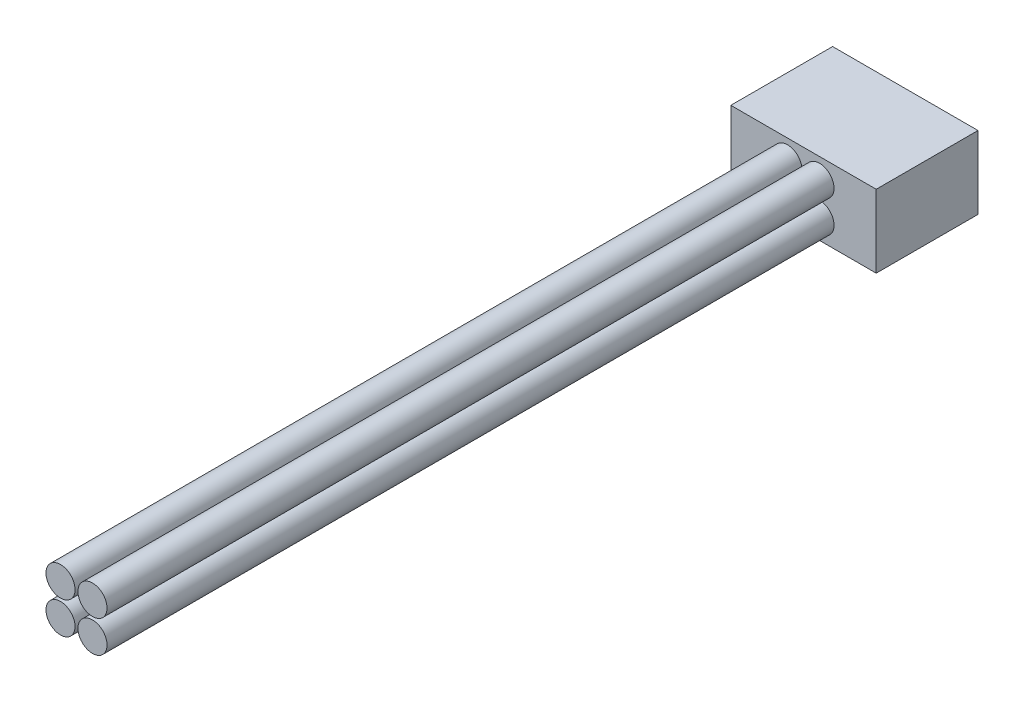
ISO-10303-21;
HEADER;
FILE_DESCRIPTION(('STEP AP214'),'2;1');
FILE_NAME('part.step','',(''),(''),'','','');
FILE_SCHEMA(('AUTOMOTIVE_DESIGN { 1 0 10303 214 1 1 1 1 }'));
ENDSEC;
DATA;
#1=APPLICATION_CONTEXT('core data for automotive mechanical design processes');
#2=APPLICATION_PROTOCOL_DEFINITION('international standard','automotive_design',2000,#1);
#3=PRODUCT_CONTEXT('',#1,'mechanical');
#4=PRODUCT('Part','Part','',(#3));
#5=PRODUCT_RELATED_PRODUCT_CATEGORY('part','',(#4));
#6=PRODUCT_DEFINITION_FORMATION('','',#4);
#7=PRODUCT_DEFINITION_CONTEXT('part definition',#1,'design');
#8=PRODUCT_DEFINITION('design','',#6,#7);
#9=PRODUCT_DEFINITION_SHAPE('','',#8);
#10=(LENGTH_UNIT() NAMED_UNIT(*) SI_UNIT(.MILLI.,.METRE.));
#11=(NAMED_UNIT(*) PLANE_ANGLE_UNIT() SI_UNIT($,.RADIAN.));
#12=(NAMED_UNIT(*) SI_UNIT($,.STERADIAN.) SOLID_ANGLE_UNIT());
#13=UNCERTAINTY_MEASURE_WITH_UNIT(LENGTH_MEASURE(1.E-05),#10,'distance_accuracy_value','');
#14=(GEOMETRIC_REPRESENTATION_CONTEXT(3) GLOBAL_UNCERTAINTY_ASSIGNED_CONTEXT((#13)) GLOBAL_UNIT_ASSIGNED_CONTEXT((#10,
#11,#12)) REPRESENTATION_CONTEXT('',''));
#15=CARTESIAN_POINT('',(0.,0.,0.));
#16=DIRECTION('',(0.,0.,1.));
#17=DIRECTION('',(1.,0.,0.));
#18=AXIS2_PLACEMENT_3D('',#15,#16,#17);
#19=CARTESIAN_POINT('',(-9.92110162967563,0.994858357638577,7.));
#20=DIRECTION('',(0.,0.,1.));
#21=DIRECTION('',(1.,0.,0.));
#22=AXIS2_PLACEMENT_3D('',#19,#20,#21);
#23=PLANE('',#22);
#24=CARTESIAN_POINT('',(-3.82110162967563,4.59485835763858,7.));
#25=DIRECTION('',(0.,0.,1.));
#26=DIRECTION('',(1.,0.,0.));
#27=AXIS2_PLACEMENT_3D('',#24,#25,#26);
#28=CIRCLE('',#27,1.);
#29=CARTESIAN_POINT('',(-2.82110162967563,4.59485835763858,7.));
#30=VERTEX_POINT('',#29);
#31=EDGE_CURVE('E277',#30,#30,#28,.T.);
#32=ORIENTED_EDGE('',*,*,#31,.F.);
#33=EDGE_LOOP('',(#32));
#34=FACE_BOUND('',#33,.T.);
#35=CARTESIAN_POINT('',(-6.02110162967563,4.59485835763858,7.));
#36=DIRECTION('',(0.,0.,1.));
#37=DIRECTION('',(1.,0.,0.));
#38=AXIS2_PLACEMENT_3D('',#35,#36,#37);
#39=CIRCLE('',#38,1.);
#40=CARTESIAN_POINT('',(-5.02110162967563,4.59485835763858,7.));
#41=VERTEX_POINT('',#40);
#42=EDGE_CURVE('E46',#41,#41,#39,.T.);
#43=ORIENTED_EDGE('',*,*,#42,.F.);
#44=EDGE_LOOP('',(#43));
#45=FACE_BOUND('',#44,.T.);
#46=DIRECTION('',(0.,-1.,0.));
#47=VECTOR('',#46,1.);
#48=CARTESIAN_POINT('',(-9.92110162967563,5.99485835763858,7.));
#49=LINE('',#48,#47);
#50=CARTESIAN_POINT('',(-9.92110162967563,5.99485835763858,7.));
#51=VERTEX_POINT('',#50);
#52=CARTESIAN_POINT('',(-9.92110162967563,0.994858357638577,7.));
#53=VERTEX_POINT('',#52);
#54=EDGE_CURVE('E90',#51,#53,#49,.T.);
#55=ORIENTED_EDGE('',*,*,#54,.T.);
#56=DIRECTION('',(1.,0.,0.));
#57=VECTOR('',#56,1.);
#58=CARTESIAN_POINT('',(-9.92110162967563,0.994858357638577,7.));
#59=LINE('',#58,#57);
#60=CARTESIAN_POINT('',(0.0788983703243681,0.994858357638577,7.));
#61=VERTEX_POINT('',#60);
#62=EDGE_CURVE('E85',#53,#61,#59,.T.);
#63=ORIENTED_EDGE('',*,*,#62,.T.);
#64=DIRECTION('',(0.,1.,0.));
#65=VECTOR('',#64,1.);
#66=CARTESIAN_POINT('',(0.0788983703243675,5.99485835763858,7.));
#67=LINE('',#66,#65);
#68=CARTESIAN_POINT('',(0.0788983703243675,5.99485835763858,7.));
#69=VERTEX_POINT('',#68);
#70=EDGE_CURVE('E88',#61,#69,#67,.T.);
#71=ORIENTED_EDGE('',*,*,#70,.T.);
#72=DIRECTION('',(-1.,0.,0.));
#73=VECTOR('',#72,1.);
#74=CARTESIAN_POINT('',(-9.92110162967563,5.99485835763858,7.));
#75=LINE('',#74,#73);
#76=EDGE_CURVE('E54',#69,#51,#75,.T.);
#77=ORIENTED_EDGE('',*,*,#76,.T.);
#78=EDGE_LOOP('',(#55,#63,#71,#77));
#79=FACE_BOUND('',#78,.T.);
#80=CARTESIAN_POINT('',(-6.02110162967563,2.39485835763858,7.));
#81=DIRECTION('',(0.,0.,1.));
#82=DIRECTION('',(1.,0.,0.));
#83=AXIS2_PLACEMENT_3D('',#80,#81,#82);
#84=CIRCLE('',#83,1.);
#85=CARTESIAN_POINT('',(-5.02110162967563,2.39485835763858,7.));
#86=VERTEX_POINT('',#85);
#87=EDGE_CURVE('E11',#86,#86,#84,.T.);
#88=ORIENTED_EDGE('',*,*,#87,.F.);
#89=EDGE_LOOP('',(#88));
#90=FACE_BOUND('',#89,.T.);
#91=CARTESIAN_POINT('',(-3.82110162967563,2.39485835763858,7.));
#92=DIRECTION('',(0.,0.,1.));
#93=DIRECTION('',(1.,0.,0.));
#94=AXIS2_PLACEMENT_3D('',#91,#92,#93);
#95=CIRCLE('',#94,1.);
#96=CARTESIAN_POINT('',(-2.82110162967563,2.39485835763858,7.));
#97=VERTEX_POINT('',#96);
#98=EDGE_CURVE('E274',#97,#97,#95,.T.);
#99=ORIENTED_EDGE('',*,*,#98,.F.);
#100=EDGE_LOOP('',(#99));
#101=FACE_BOUND('',#100,.T.);
#102=ADVANCED_FACE('F37',(#34,#45,#79,#90,#101),#23,.T.);
#103=CARTESIAN_POINT('',(-9.92110162967563,5.99485835763858,7.));
#104=DIRECTION('',(1.,0.,0.));
#105=DIRECTION('',(0.,0.,-1.));
#106=AXIS2_PLACEMENT_3D('',#103,#104,#105);
#107=PLANE('',#106);
#108=DIRECTION('',(0.,-1.,0.));
#109=VECTOR('',#108,1.);
#110=CARTESIAN_POINT('',(-9.92110162967563,5.99485835763858,0.));
#111=LINE('',#110,#109);
#112=CARTESIAN_POINT('',(-9.92110162967563,5.99485835763858,0.));
#113=VERTEX_POINT('',#112);
#114=CARTESIAN_POINT('',(-9.92110162967563,0.994858357638577,0.));
#115=VERTEX_POINT('',#114);
#116=EDGE_CURVE('E105',#113,#115,#111,.T.);
#117=ORIENTED_EDGE('',*,*,#116,.T.);
#118=DIRECTION('',(0.,0.,-1.));
#119=VECTOR('',#118,1.);
#120=CARTESIAN_POINT('',(-9.92110162967563,0.994858357638577,7.));
#121=LINE('',#120,#119);
#122=EDGE_CURVE('E96',#53,#115,#121,.T.);
#123=ORIENTED_EDGE('',*,*,#122,.F.);
#124=ORIENTED_EDGE('',*,*,#54,.F.);
#125=DIRECTION('',(0.,0.,-1.));
#126=VECTOR('',#125,1.);
#127=CARTESIAN_POINT('',(-9.92110162967563,5.99485835763858,7.));
#128=LINE('',#127,#126);
#129=EDGE_CURVE('E101',#51,#113,#128,.T.);
#130=ORIENTED_EDGE('',*,*,#129,.T.);
#131=EDGE_LOOP('',(#117,#123,#124,#130));
#132=FACE_BOUND('',#131,.T.);
#133=ADVANCED_FACE('F39',(#132),#107,.F.);
#134=CARTESIAN_POINT('',(-9.92110162967563,0.994858357638577,7.));
#135=DIRECTION('',(0.,1.,0.));
#136=DIRECTION('',(0.,0.,1.));
#137=AXIS2_PLACEMENT_3D('',#134,#135,#136);
#138=PLANE('',#137);
#139=DIRECTION('',(1.,0.,0.));
#140=VECTOR('',#139,1.);
#141=CARTESIAN_POINT('',(-9.92110162967563,0.994858357638577,0.));
#142=LINE('',#141,#140);
#143=CARTESIAN_POINT('',(0.0788983703243681,0.994858357638577,0.));
#144=VERTEX_POINT('',#143);
#145=EDGE_CURVE('E95',#115,#144,#142,.T.);
#146=ORIENTED_EDGE('',*,*,#145,.T.);
#147=DIRECTION('',(0.,0.,-1.));
#148=VECTOR('',#147,1.);
#149=CARTESIAN_POINT('',(0.0788983703243681,0.994858357638577,7.));
#150=LINE('',#149,#148);
#151=EDGE_CURVE('E93',#61,#144,#150,.T.);
#152=ORIENTED_EDGE('',*,*,#151,.F.);
#153=ORIENTED_EDGE('',*,*,#62,.F.);
#154=ORIENTED_EDGE('',*,*,#122,.T.);
#155=EDGE_LOOP('',(#146,#152,#153,#154));
#156=FACE_BOUND('',#155,.T.);
#157=ADVANCED_FACE('F94',(#156),#138,.F.);
#158=CARTESIAN_POINT('',(0.0788983703243675,5.99485835763858,7.));
#159=DIRECTION('',(-1.,0.,0.));
#160=DIRECTION('',(0.,-1.,0.));
#161=AXIS2_PLACEMENT_3D('',#158,#159,#160);
#162=PLANE('',#161);
#163=DIRECTION('',(0.,1.,0.));
#164=VECTOR('',#163,1.);
#165=CARTESIAN_POINT('',(0.0788983703243675,5.99485835763858,0.));
#166=LINE('',#165,#164);
#167=CARTESIAN_POINT('',(0.0788983703243675,5.99485835763858,0.));
#168=VERTEX_POINT('',#167);
#169=EDGE_CURVE('E71',#144,#168,#166,.T.);
#170=ORIENTED_EDGE('',*,*,#169,.T.);
#171=DIRECTION('',(0.,0.,-1.));
#172=VECTOR('',#171,1.);
#173=CARTESIAN_POINT('',(0.0788983703243675,5.99485835763858,7.));
#174=LINE('',#173,#172);
#175=EDGE_CURVE('E97',#69,#168,#174,.T.);
#176=ORIENTED_EDGE('',*,*,#175,.F.);
#177=ORIENTED_EDGE('',*,*,#70,.F.);
#178=ORIENTED_EDGE('',*,*,#151,.T.);
#179=EDGE_LOOP('',(#170,#176,#177,#178));
#180=FACE_BOUND('',#179,.T.);
#181=ADVANCED_FACE('F99',(#180),#162,.F.);
#182=CARTESIAN_POINT('',(-9.92110162967563,5.99485835763858,7.));
#183=DIRECTION('',(0.,-1.,0.));
#184=DIRECTION('',(0.,0.,-1.));
#185=AXIS2_PLACEMENT_3D('',#182,#183,#184);
#186=PLANE('',#185);
#187=DIRECTION('',(-1.,0.,0.));
#188=VECTOR('',#187,1.);
#189=CARTESIAN_POINT('',(-9.92110162967563,5.99485835763858,0.));
#190=LINE('',#189,#188);
#191=EDGE_CURVE('E77',#168,#113,#190,.T.);
#192=ORIENTED_EDGE('',*,*,#191,.T.);
#193=ORIENTED_EDGE('',*,*,#129,.F.);
#194=ORIENTED_EDGE('',*,*,#76,.F.);
#195=ORIENTED_EDGE('',*,*,#175,.T.);
#196=EDGE_LOOP('',(#192,#193,#194,#195));
#197=FACE_BOUND('',#196,.T.);
#198=ADVANCED_FACE('F133',(#197),#186,.F.);
#199=CARTESIAN_POINT('',(-9.92110162967563,0.994858357638577,0.));
#200=DIRECTION('',(0.,0.,1.));
#201=DIRECTION('',(1.,0.,0.));
#202=AXIS2_PLACEMENT_3D('',#199,#200,#201);
#203=PLANE('',#202);
#204=ORIENTED_EDGE('',*,*,#116,.F.);
#205=ORIENTED_EDGE('',*,*,#191,.F.);
#206=ORIENTED_EDGE('',*,*,#169,.F.);
#207=ORIENTED_EDGE('',*,*,#145,.F.);
#208=EDGE_LOOP('',(#204,#205,#206,#207));
#209=FACE_BOUND('',#208,.T.);
#210=ADVANCED_FACE('F130',(#209),#203,.F.);
#211=CARTESIAN_POINT('',(-6.02110162967563,4.59485835763858,57.));
#212=DIRECTION('',(0.,0.,-1.));
#213=DIRECTION('',(-1.,0.,0.));
#214=AXIS2_PLACEMENT_3D('',#211,#212,#213);
#215=CYLINDRICAL_SURFACE('',#214,1.);
#216=CARTESIAN_POINT('',(-6.02110162967563,4.59485835763858,57.));
#217=DIRECTION('',(0.,0.,1.));
#218=DIRECTION('',(1.,0.,0.));
#219=AXIS2_PLACEMENT_3D('',#216,#217,#218);
#220=CIRCLE('',#219,1.);
#221=CARTESIAN_POINT('',(-5.02110162967563,4.59485835763858,57.));
#222=VERTEX_POINT('',#221);
#223=EDGE_CURVE('E108',#222,#222,#220,.F.);
#224=ORIENTED_EDGE('',*,*,#223,.T.);
#225=EDGE_LOOP('',(#224));
#226=FACE_BOUND('',#225,.T.);
#227=ORIENTED_EDGE('',*,*,#42,.T.);
#228=EDGE_LOOP('',(#227));
#229=FACE_BOUND('',#228,.T.);
#230=ADVANCED_FACE('F117',(#226,#229),#215,.T.);
#231=CARTESIAN_POINT('',(-4.92110162967563,-5.34282656406178,57.));
#232=DIRECTION('',(0.,0.,1.));
#233=DIRECTION('',(1.,0.,0.));
#234=AXIS2_PLACEMENT_3D('',#231,#232,#233);
#235=PLANE('',#234);
#236=ORIENTED_EDGE('',*,*,#223,.F.);
#237=EDGE_LOOP('',(#236));
#238=FACE_BOUND('',#237,.T.);
#239=ADVANCED_FACE('F161',(#238),#235,.T.);
#240=CARTESIAN_POINT('',(-3.82110162967563,4.59485835763858,57.));
#241=DIRECTION('',(0.,0.,-1.));
#242=DIRECTION('',(-1.,0.,0.));
#243=AXIS2_PLACEMENT_3D('',#240,#241,#242);
#244=CYLINDRICAL_SURFACE('',#243,1.);
#245=CARTESIAN_POINT('',(-3.82110162967563,4.59485835763858,57.));
#246=DIRECTION('',(0.,0.,1.));
#247=DIRECTION('',(1.,0.,0.));
#248=AXIS2_PLACEMENT_3D('',#245,#246,#247);
#249=CIRCLE('',#248,1.);
#250=CARTESIAN_POINT('',(-2.82110162967563,4.59485835763858,57.));
#251=VERTEX_POINT('',#250);
#252=EDGE_CURVE('E282',#251,#251,#249,.T.);
#253=ORIENTED_EDGE('',*,*,#252,.F.);
#254=EDGE_LOOP('',(#253));
#255=FACE_BOUND('',#254,.T.);
#256=ORIENTED_EDGE('',*,*,#31,.T.);
#257=EDGE_LOOP('',(#256));
#258=FACE_BOUND('',#257,.T.);
#259=ADVANCED_FACE('F169',(#255,#258),#244,.T.);
#260=CARTESIAN_POINT('',(-4.92110162967563,-5.34282656406178,57.));
#261=DIRECTION('',(0.,0.,1.));
#262=DIRECTION('',(1.,0.,0.));
#263=AXIS2_PLACEMENT_3D('',#260,#261,#262);
#264=PLANE('',#263);
#265=ORIENTED_EDGE('',*,*,#252,.T.);
#266=EDGE_LOOP('',(#265));
#267=FACE_BOUND('',#266,.T.);
#268=ADVANCED_FACE('F176',(#267),#264,.T.);
#269=CARTESIAN_POINT('',(-6.02110162967563,2.39485835763858,57.));
#270=DIRECTION('',(0.,0.,-1.));
#271=DIRECTION('',(-1.,0.,0.));
#272=AXIS2_PLACEMENT_3D('',#269,#270,#271);
#273=CYLINDRICAL_SURFACE('',#272,1.);
#274=CARTESIAN_POINT('',(-6.02110162967563,2.39485835763858,57.));
#275=DIRECTION('',(0.,0.,1.));
#276=DIRECTION('',(1.,0.,0.));
#277=AXIS2_PLACEMENT_3D('',#274,#275,#276);
#278=CIRCLE('',#277,1.);
#279=CARTESIAN_POINT('',(-5.02110162967563,2.39485835763858,57.));
#280=VERTEX_POINT('',#279);
#281=EDGE_CURVE('E273',#280,#280,#278,.F.);
#282=ORIENTED_EDGE('',*,*,#281,.T.);
#283=EDGE_LOOP('',(#282));
#284=FACE_BOUND('',#283,.T.);
#285=ORIENTED_EDGE('',*,*,#87,.T.);
#286=EDGE_LOOP('',(#285));
#287=FACE_BOUND('',#286,.T.);
#288=ADVANCED_FACE('F184',(#284,#287),#273,.T.);
#289=CARTESIAN_POINT('',(-4.92110162967563,-5.34282656406178,57.));
#290=DIRECTION('',(0.,0.,1.));
#291=DIRECTION('',(1.,0.,0.));
#292=AXIS2_PLACEMENT_3D('',#289,#290,#291);
#293=PLANE('',#292);
#294=ORIENTED_EDGE('',*,*,#281,.F.);
#295=EDGE_LOOP('',(#294));
#296=FACE_BOUND('',#295,.T.);
#297=ADVANCED_FACE('F192',(#296),#293,.T.);
#298=CARTESIAN_POINT('',(-3.82110162967563,2.39485835763858,57.));
#299=DIRECTION('',(0.,0.,-1.));
#300=DIRECTION('',(-1.,0.,0.));
#301=AXIS2_PLACEMENT_3D('',#298,#299,#300);
#302=CYLINDRICAL_SURFACE('',#301,1.);
#303=CARTESIAN_POINT('',(-3.82110162967563,2.39485835763858,57.));
#304=DIRECTION('',(0.,0.,1.));
#305=DIRECTION('',(1.,0.,0.));
#306=AXIS2_PLACEMENT_3D('',#303,#304,#305);
#307=CIRCLE('',#306,1.);
#308=CARTESIAN_POINT('',(-2.82110162967563,2.39485835763858,57.));
#309=VERTEX_POINT('',#308);
#310=EDGE_CURVE('E272',#309,#309,#307,.T.);
#311=ORIENTED_EDGE('',*,*,#310,.F.);
#312=EDGE_LOOP('',(#311));
#313=FACE_BOUND('',#312,.T.);
#314=ORIENTED_EDGE('',*,*,#98,.T.);
#315=EDGE_LOOP('',(#314));
#316=FACE_BOUND('',#315,.T.);
#317=ADVANCED_FACE('F200',(#313,#316),#302,.T.);
#318=CARTESIAN_POINT('',(-4.92110162967563,-5.34282656406178,57.));
#319=DIRECTION('',(0.,0.,1.));
#320=DIRECTION('',(1.,0.,0.));
#321=AXIS2_PLACEMENT_3D('',#318,#319,#320);
#322=PLANE('',#321);
#323=ORIENTED_EDGE('',*,*,#310,.T.);
#324=EDGE_LOOP('',(#323));
#325=FACE_BOUND('',#324,.T.);
#326=ADVANCED_FACE('F208',(#325),#322,.T.);
#327=CLOSED_SHELL('',(#102,#133,#157,#181,#198,#210,#230,#239,#259,#268,#288,#297,#317,#326));
#328=MANIFOLD_SOLID_BREP('B2',#327);
#329=ADVANCED_BREP_SHAPE_REPRESENTATION('',(#18,#328),#14);
#330=SHAPE_DEFINITION_REPRESENTATION(#9,#329);
ENDSEC;
END-ISO-10303-21;
